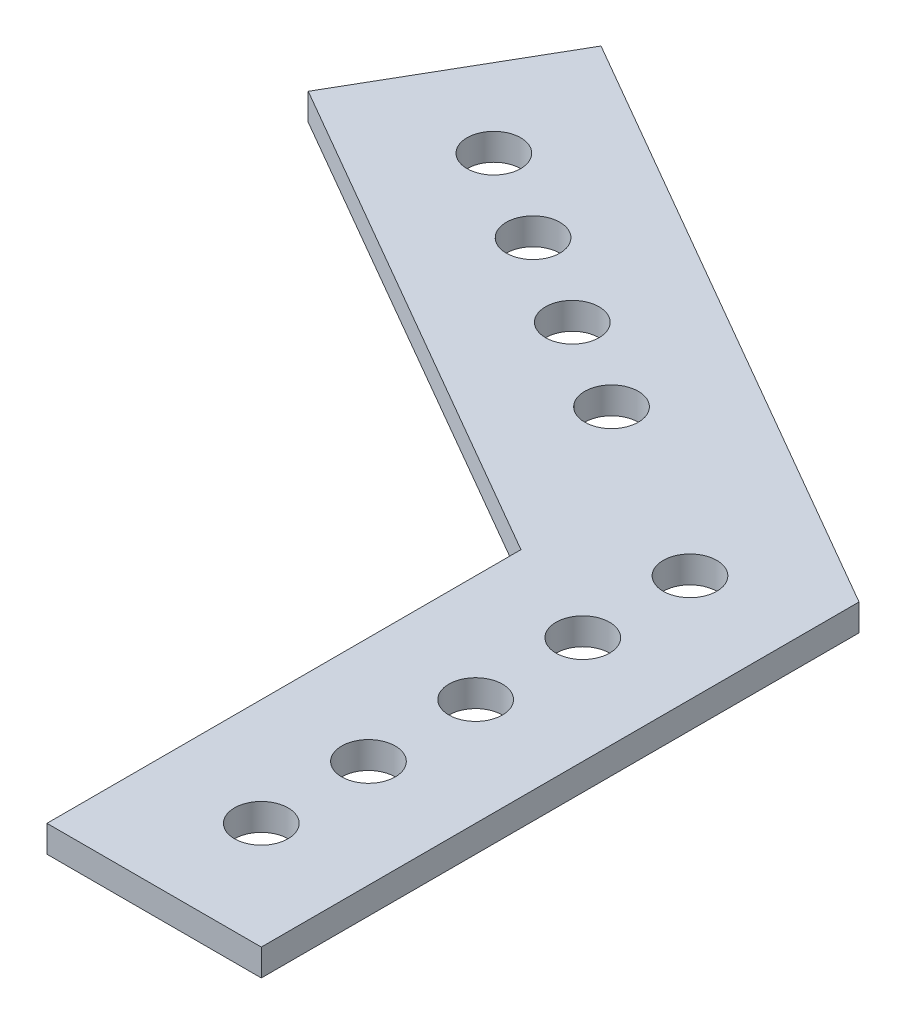
ISO-10303-21;
HEADER;
FILE_DESCRIPTION(('STEP AP214'),'2;1');
FILE_NAME('part.step','',(''),(''),'','','');
FILE_SCHEMA(('AUTOMOTIVE_DESIGN { 1 0 10303 214 1 1 1 1 }'));
ENDSEC;
DATA;
#1=APPLICATION_CONTEXT('core data for automotive mechanical design processes');
#2=APPLICATION_PROTOCOL_DEFINITION('international standard','automotive_design',2000,#1);
#3=PRODUCT_CONTEXT('',#1,'mechanical');
#4=PRODUCT('Part','Part','',(#3));
#5=PRODUCT_RELATED_PRODUCT_CATEGORY('part','',(#4));
#6=PRODUCT_DEFINITION_FORMATION('','',#4);
#7=PRODUCT_DEFINITION_CONTEXT('part definition',#1,'design');
#8=PRODUCT_DEFINITION('design','',#6,#7);
#9=PRODUCT_DEFINITION_SHAPE('','',#8);
#10=(LENGTH_UNIT() NAMED_UNIT(*) SI_UNIT(.MILLI.,.METRE.));
#11=(NAMED_UNIT(*) PLANE_ANGLE_UNIT() SI_UNIT($,.RADIAN.));
#12=(NAMED_UNIT(*) SI_UNIT($,.STERADIAN.) SOLID_ANGLE_UNIT());
#13=UNCERTAINTY_MEASURE_WITH_UNIT(LENGTH_MEASURE(1.E-05),#10,'distance_accuracy_value','');
#14=(GEOMETRIC_REPRESENTATION_CONTEXT(3) GLOBAL_UNCERTAINTY_ASSIGNED_CONTEXT((#13)) GLOBAL_UNIT_ASSIGNED_CONTEXT((#10,
#11,#12)) REPRESENTATION_CONTEXT('',''));
#15=CARTESIAN_POINT('',(0.,0.,0.));
#16=DIRECTION('',(0.,0.,1.));
#17=DIRECTION('',(1.,0.,0.));
#18=AXIS2_PLACEMENT_3D('',#15,#16,#17);
#19=CARTESIAN_POINT('',(12.7,3.175,-7.33234841870821));
#20=DIRECTION('',(-0.500000000000004,0.,0.866025403784436));
#21=DIRECTION('',(0.866025403784436,0.,0.500000000000004));
#22=AXIS2_PLACEMENT_3D('',#19,#20,#21);
#23=PLANE('',#22);
#24=DIRECTION('',(-0.866025403784436,0.,-0.500000000000004));
#25=VECTOR('',#24,1.);
#26=CARTESIAN_POINT('',(12.7,0.,-7.33234841870821));
#27=LINE('',#26,#25);
#28=CARTESIAN_POINT('',(12.7,0.,-7.33234841870821));
#29=VERTEX_POINT('',#28);
#30=CARTESIAN_POINT('',(-59.641135768374,0.,-49.0985226280626));
#31=VERTEX_POINT('',#30);
#32=EDGE_CURVE('E119',#29,#31,#27,.T.);
#33=ORIENTED_EDGE('',*,*,#32,.T.);
#34=DIRECTION('',(0.,-1.,0.));
#35=VECTOR('',#34,1.);
#36=CARTESIAN_POINT('',(-59.641135768374,3.175,-49.0985226280626));
#37=LINE('',#36,#35);
#38=CARTESIAN_POINT('',(-59.641135768374,3.175,-49.0985226280626));
#39=VERTEX_POINT('',#38);
#40=EDGE_CURVE('E11',#39,#31,#37,.T.);
#41=ORIENTED_EDGE('',*,*,#40,.F.);
#42=DIRECTION('',(-0.866025403784436,0.,-0.500000000000004));
#43=VECTOR('',#42,1.);
#44=CARTESIAN_POINT('',(12.7,3.175,-7.33234841870821));
#45=LINE('',#44,#43);
#46=CARTESIAN_POINT('',(12.7,3.175,-7.33234841870821));
#47=VERTEX_POINT('',#46);
#48=EDGE_CURVE('E130',#47,#39,#45,.T.);
#49=ORIENTED_EDGE('',*,*,#48,.F.);
#50=DIRECTION('',(0.,-1.,0.));
#51=VECTOR('',#50,1.);
#52=CARTESIAN_POINT('',(12.7,3.175,-7.33234841870821));
#53=LINE('',#52,#51);
#54=EDGE_CURVE('E115',#47,#29,#53,.T.);
#55=ORIENTED_EDGE('',*,*,#54,.T.);
#56=EDGE_LOOP('',(#33,#41,#49,#55));
#57=FACE_BOUND('',#56,.T.);
#58=ADVANCED_FACE('F35',(#57),#23,.F.);
#59=CARTESIAN_POINT('',(-72.3411357683741,3.175,-27.101477371938));
#60=DIRECTION('',(0.866025403784436,0.,0.500000000000004));
#61=DIRECTION('',(0.500000000000004,0.,-0.866025403784436));
#62=AXIS2_PLACEMENT_3D('',#59,#60,#61);
#63=PLANE('',#62);
#64=DIRECTION('',(-0.500000000000004,0.,0.866025403784436));
#65=VECTOR('',#64,1.);
#66=CARTESIAN_POINT('',(-72.3411357683741,0.,-27.101477371938));
#67=LINE('',#66,#65);
#68=CARTESIAN_POINT('',(-72.3411357683741,0.,-27.101477371938));
#69=VERTEX_POINT('',#68);
#70=EDGE_CURVE('E122',#31,#69,#67,.T.);
#71=ORIENTED_EDGE('',*,*,#70,.T.);
#72=DIRECTION('',(0.,-1.,0.));
#73=VECTOR('',#72,1.);
#74=CARTESIAN_POINT('',(-72.3411357683741,3.175,-27.101477371938));
#75=LINE('',#74,#73);
#76=CARTESIAN_POINT('',(-72.3411357683741,3.175,-27.101477371938));
#77=VERTEX_POINT('',#76);
#78=EDGE_CURVE('E43',#77,#69,#75,.T.);
#79=ORIENTED_EDGE('',*,*,#78,.F.);
#80=DIRECTION('',(-0.500000000000004,0.,0.866025403784436));
#81=VECTOR('',#80,1.);
#82=CARTESIAN_POINT('',(-72.3411357683741,3.175,-27.101477371938));
#83=LINE('',#82,#81);
#84=EDGE_CURVE('E88',#39,#77,#83,.T.);
#85=ORIENTED_EDGE('',*,*,#84,.F.);
#86=ORIENTED_EDGE('',*,*,#40,.T.);
#87=EDGE_LOOP('',(#71,#79,#85,#86));
#88=FACE_BOUND('',#87,.T.);
#89=ADVANCED_FACE('F155',(#88),#63,.F.);
#90=CARTESIAN_POINT('',(-12.7,3.175,7.33234841870821));
#91=DIRECTION('',(0.500000000000004,0.,-0.866025403784436));
#92=DIRECTION('',(-0.866025403784436,0.,-0.500000000000004));
#93=AXIS2_PLACEMENT_3D('',#90,#91,#92);
#94=PLANE('',#93);
#95=DIRECTION('',(0.866025403784436,0.,0.500000000000004));
#96=VECTOR('',#95,1.);
#97=CARTESIAN_POINT('',(-12.7,0.,7.33234841870821));
#98=LINE('',#97,#96);
#99=CARTESIAN_POINT('',(-12.7,0.,7.33234841870821));
#100=VERTEX_POINT('',#99);
#101=EDGE_CURVE('E125',#69,#100,#98,.T.);
#102=ORIENTED_EDGE('',*,*,#101,.T.);
#103=DIRECTION('',(0.,-1.,0.));
#104=VECTOR('',#103,1.);
#105=CARTESIAN_POINT('',(-12.7,3.175,7.33234841870821));
#106=LINE('',#105,#104);
#107=CARTESIAN_POINT('',(-12.7,3.175,7.33234841870821));
#108=VERTEX_POINT('',#107);
#109=EDGE_CURVE('E110',#108,#100,#106,.T.);
#110=ORIENTED_EDGE('',*,*,#109,.F.);
#111=DIRECTION('',(0.866025403784436,0.,0.500000000000004));
#112=VECTOR('',#111,1.);
#113=CARTESIAN_POINT('',(-12.7,3.175,7.33234841870821));
#114=LINE('',#113,#112);
#115=EDGE_CURVE('E101',#77,#108,#114,.T.);
#116=ORIENTED_EDGE('',*,*,#115,.F.);
#117=ORIENTED_EDGE('',*,*,#78,.T.);
#118=EDGE_LOOP('',(#102,#110,#116,#117));
#119=FACE_BOUND('',#118,.T.);
#120=ADVANCED_FACE('F136',(#119),#94,.F.);
#121=CARTESIAN_POINT('',(-12.7,3.175,7.33234841870821));
#122=DIRECTION('',(1.,0.,0.));
#123=DIRECTION('',(0.,0.,-1.));
#124=AXIS2_PLACEMENT_3D('',#121,#122,#123);
#125=PLANE('',#124);
#126=DIRECTION('',(0.,0.,1.));
#127=VECTOR('',#126,1.);
#128=CARTESIAN_POINT('',(-12.7,0.,7.33234841870821));
#129=LINE('',#128,#127);
#130=CARTESIAN_POINT('',(-12.7,0.,63.5));
#131=VERTEX_POINT('',#130);
#132=EDGE_CURVE('E109',#100,#131,#129,.T.);
#133=ORIENTED_EDGE('',*,*,#132,.T.);
#134=DIRECTION('',(0.,-1.,0.));
#135=VECTOR('',#134,1.);
#136=CARTESIAN_POINT('',(-12.7,3.175,63.5));
#137=LINE('',#136,#135);
#138=CARTESIAN_POINT('',(-12.7,3.175,63.5));
#139=VERTEX_POINT('',#138);
#140=EDGE_CURVE('E106',#139,#131,#137,.T.);
#141=ORIENTED_EDGE('',*,*,#140,.F.);
#142=DIRECTION('',(0.,0.,1.));
#143=VECTOR('',#142,1.);
#144=CARTESIAN_POINT('',(-12.7,3.175,7.33234841870821));
#145=LINE('',#144,#143);
#146=EDGE_CURVE('E95',#108,#139,#145,.T.);
#147=ORIENTED_EDGE('',*,*,#146,.F.);
#148=ORIENTED_EDGE('',*,*,#109,.T.);
#149=EDGE_LOOP('',(#133,#141,#147,#148));
#150=FACE_BOUND('',#149,.T.);
#151=ADVANCED_FACE('F107',(#150),#125,.F.);
#152=CARTESIAN_POINT('',(-12.7,3.175,63.5));
#153=DIRECTION('',(0.,0.,-1.));
#154=DIRECTION('',(-1.,0.,0.));
#155=AXIS2_PLACEMENT_3D('',#152,#153,#154);
#156=PLANE('',#155);
#157=DIRECTION('',(1.,0.,0.));
#158=VECTOR('',#157,1.);
#159=CARTESIAN_POINT('',(-12.7,0.,63.5));
#160=LINE('',#159,#158);
#161=CARTESIAN_POINT('',(12.7,0.,63.5));
#162=VERTEX_POINT('',#161);
#163=EDGE_CURVE('E74',#131,#162,#160,.T.);
#164=ORIENTED_EDGE('',*,*,#163,.T.);
#165=DIRECTION('',(0.,-1.,0.));
#166=VECTOR('',#165,1.);
#167=CARTESIAN_POINT('',(12.7,3.175,63.5));
#168=LINE('',#167,#166);
#169=CARTESIAN_POINT('',(12.7,3.175,63.5));
#170=VERTEX_POINT('',#169);
#171=EDGE_CURVE('E111',#170,#162,#168,.T.);
#172=ORIENTED_EDGE('',*,*,#171,.F.);
#173=DIRECTION('',(1.,0.,0.));
#174=VECTOR('',#173,1.);
#175=CARTESIAN_POINT('',(-12.7,3.175,63.5));
#176=LINE('',#175,#174);
#177=EDGE_CURVE('E99',#139,#170,#176,.T.);
#178=ORIENTED_EDGE('',*,*,#177,.F.);
#179=ORIENTED_EDGE('',*,*,#140,.T.);
#180=EDGE_LOOP('',(#164,#172,#178,#179));
#181=FACE_BOUND('',#180,.T.);
#182=ADVANCED_FACE('F113',(#181),#156,.F.);
#183=CARTESIAN_POINT('',(12.7,3.175,-7.33234841870821));
#184=DIRECTION('',(-1.,0.,0.));
#185=DIRECTION('',(0.,0.,1.));
#186=AXIS2_PLACEMENT_3D('',#183,#184,#185);
#187=PLANE('',#186);
#188=DIRECTION('',(0.,0.,-1.));
#189=VECTOR('',#188,1.);
#190=CARTESIAN_POINT('',(12.7,0.,-7.33234841870821));
#191=LINE('',#190,#189);
#192=EDGE_CURVE('E80',#162,#29,#191,.T.);
#193=ORIENTED_EDGE('',*,*,#192,.T.);
#194=ORIENTED_EDGE('',*,*,#54,.F.);
#195=DIRECTION('',(0.,0.,-1.));
#196=VECTOR('',#195,1.);
#197=CARTESIAN_POINT('',(12.7,3.175,-7.33234841870821));
#198=LINE('',#197,#196);
#199=EDGE_CURVE('E51',#170,#47,#198,.T.);
#200=ORIENTED_EDGE('',*,*,#199,.F.);
#201=ORIENTED_EDGE('',*,*,#171,.T.);
#202=EDGE_LOOP('',(#193,#194,#200,#201));
#203=FACE_BOUND('',#202,.T.);
#204=ADVANCED_FACE('F143',(#203),#187,.F.);
#205=CARTESIAN_POINT('',(0.,3.175,0.));
#206=DIRECTION('',(0.,-1.,0.));
#207=DIRECTION('',(0.,0.,-1.));
#208=AXIS2_PLACEMENT_3D('',#205,#206,#207);
#209=PLANE('',#208);
#210=CARTESIAN_POINT('',(0.,3.175,12.7));
#211=DIRECTION('',(0.,1.,0.));
#212=DIRECTION('',(0.,0.,1.));
#213=AXIS2_PLACEMENT_3D('',#210,#211,#212);
#214=CIRCLE('',#213,3.175);
#215=CARTESIAN_POINT('',(0.,3.175,15.875));
#216=VERTEX_POINT('',#215);
#217=EDGE_CURVE('E293',#216,#216,#214,.T.);
#218=ORIENTED_EDGE('',*,*,#217,.F.);
#219=EDGE_LOOP('',(#218));
#220=FACE_BOUND('',#219,.T.);
#221=CARTESIAN_POINT('',(0.,3.175,25.4));
#222=DIRECTION('',(0.,1.,0.));
#223=DIRECTION('',(0.,0.,1.));
#224=AXIS2_PLACEMENT_3D('',#221,#222,#223);
#225=CIRCLE('',#224,3.175);
#226=CARTESIAN_POINT('',(0.,3.175,28.575));
#227=VERTEX_POINT('',#226);
#228=EDGE_CURVE('E295',#227,#227,#225,.T.);
#229=ORIENTED_EDGE('',*,*,#228,.F.);
#230=EDGE_LOOP('',(#229));
#231=FACE_BOUND('',#230,.T.);
#232=CARTESIAN_POINT('',(0.,3.175,38.1));
#233=DIRECTION('',(0.,1.,0.));
#234=DIRECTION('',(0.,0.,1.));
#235=AXIS2_PLACEMENT_3D('',#232,#233,#234);
#236=CIRCLE('',#235,3.175);
#237=CARTESIAN_POINT('',(0.,3.175,41.275));
#238=VERTEX_POINT('',#237);
#239=EDGE_CURVE('E301',#238,#238,#236,.T.);
#240=ORIENTED_EDGE('',*,*,#239,.F.);
#241=EDGE_LOOP('',(#240));
#242=FACE_BOUND('',#241,.T.);
#243=CARTESIAN_POINT('',(0.,3.175,50.8));
#244=DIRECTION('',(0.,1.,0.));
#245=DIRECTION('',(0.,0.,1.));
#246=AXIS2_PLACEMENT_3D('',#243,#244,#245);
#247=CIRCLE('',#246,3.175);
#248=CARTESIAN_POINT('',(0.,3.175,53.975));
#249=VERTEX_POINT('',#248);
#250=EDGE_CURVE('E307',#249,#249,#247,.T.);
#251=ORIENTED_EDGE('',*,*,#250,.F.);
#252=EDGE_LOOP('',(#251));
#253=FACE_BOUND('',#252,.T.);
#254=CARTESIAN_POINT('',(0.,3.175,0.));
#255=DIRECTION('',(0.,1.,0.));
#256=DIRECTION('',(0.,0.,1.));
#257=AXIS2_PLACEMENT_3D('',#254,#255,#256);
#258=CIRCLE('',#257,3.175);
#259=CARTESIAN_POINT('',(0.,3.175,3.175));
#260=VERTEX_POINT('',#259);
#261=EDGE_CURVE('E313',#260,#260,#258,.T.);
#262=ORIENTED_EDGE('',*,*,#261,.F.);
#263=EDGE_LOOP('',(#262));
#264=FACE_BOUND('',#263,.T.);
#265=CARTESIAN_POINT('',(-21.9970452561244,3.175,-12.7000000000005));
#266=DIRECTION('',(0.,1.,0.));
#267=DIRECTION('',(0.,0.,1.));
#268=AXIS2_PLACEMENT_3D('',#265,#266,#267);
#269=CIRCLE('',#268,3.175);
#270=CARTESIAN_POINT('',(-21.9970452561244,3.175,-9.52500000000052));
#271=VERTEX_POINT('',#270);
#272=EDGE_CURVE('E319',#271,#271,#269,.T.);
#273=ORIENTED_EDGE('',*,*,#272,.F.);
#274=EDGE_LOOP('',(#273));
#275=FACE_BOUND('',#274,.T.);
#276=CARTESIAN_POINT('',(-32.9955678841869,3.175,-19.0500000000004));
#277=DIRECTION('',(0.,1.,0.));
#278=DIRECTION('',(0.,0.,1.));
#279=AXIS2_PLACEMENT_3D('',#276,#277,#278);
#280=CIRCLE('',#279,3.175);
#281=CARTESIAN_POINT('',(-32.9955678841869,3.175,-15.8750000000004));
#282=VERTEX_POINT('',#281);
#283=EDGE_CURVE('E325',#282,#282,#280,.T.);
#284=ORIENTED_EDGE('',*,*,#283,.F.);
#285=EDGE_LOOP('',(#284));
#286=FACE_BOUND('',#285,.T.);
#287=CARTESIAN_POINT('',(-43.9940905122493,3.175,-25.4000000000003));
#288=DIRECTION('',(0.,1.,0.));
#289=DIRECTION('',(0.,0.,1.));
#290=AXIS2_PLACEMENT_3D('',#287,#288,#289);
#291=CIRCLE('',#290,3.175);
#292=CARTESIAN_POINT('',(-43.9940905122493,3.175,-22.2250000000003));
#293=VERTEX_POINT('',#292);
#294=EDGE_CURVE('E331',#293,#293,#291,.T.);
#295=ORIENTED_EDGE('',*,*,#294,.F.);
#296=EDGE_LOOP('',(#295));
#297=FACE_BOUND('',#296,.T.);
#298=CARTESIAN_POINT('',(-54.9926131403117,3.175,-31.7500000000003));
#299=DIRECTION('',(0.,1.,0.));
#300=DIRECTION('',(0.,0.,1.));
#301=AXIS2_PLACEMENT_3D('',#298,#299,#300);
#302=CIRCLE('',#301,3.17500000000001);
#303=CARTESIAN_POINT('',(-54.9926131403117,3.175,-28.5750000000003));
#304=VERTEX_POINT('',#303);
#305=EDGE_CURVE('E337',#304,#304,#302,.T.);
#306=ORIENTED_EDGE('',*,*,#305,.F.);
#307=EDGE_LOOP('',(#306));
#308=FACE_BOUND('',#307,.T.);
#309=ORIENTED_EDGE('',*,*,#48,.T.);
#310=ORIENTED_EDGE('',*,*,#84,.T.);
#311=ORIENTED_EDGE('',*,*,#115,.T.);
#312=ORIENTED_EDGE('',*,*,#146,.T.);
#313=ORIENTED_EDGE('',*,*,#177,.T.);
#314=ORIENTED_EDGE('',*,*,#199,.T.);
#315=EDGE_LOOP('',(#309,#310,#311,#312,#313,#314));
#316=FACE_BOUND('',#315,.T.);
#317=ADVANCED_FACE('F97',(#220,#231,#242,#253,#264,#275,#286,#297,#308,#316),#209,.F.);
#318=CARTESIAN_POINT('',(0.,0.,0.));
#319=DIRECTION('',(0.,-1.,0.));
#320=DIRECTION('',(0.,0.,-1.));
#321=AXIS2_PLACEMENT_3D('',#318,#319,#320);
#322=PLANE('',#321);
#323=CARTESIAN_POINT('',(0.,0.,12.7));
#324=DIRECTION('',(0.,1.,0.));
#325=DIRECTION('',(0.,0.,1.));
#326=AXIS2_PLACEMENT_3D('',#323,#324,#325);
#327=CIRCLE('',#326,3.175);
#328=CARTESIAN_POINT('',(0.,0.,15.875));
#329=VERTEX_POINT('',#328);
#330=EDGE_CURVE('E290',#329,#329,#327,.T.);
#331=ORIENTED_EDGE('',*,*,#330,.T.);
#332=EDGE_LOOP('',(#331));
#333=FACE_BOUND('',#332,.T.);
#334=CARTESIAN_POINT('',(0.,0.,25.4));
#335=DIRECTION('',(0.,1.,0.));
#336=DIRECTION('',(0.,0.,1.));
#337=AXIS2_PLACEMENT_3D('',#334,#335,#336);
#338=CIRCLE('',#337,3.175);
#339=CARTESIAN_POINT('',(0.,0.,28.575));
#340=VERTEX_POINT('',#339);
#341=EDGE_CURVE('E298',#340,#340,#338,.T.);
#342=ORIENTED_EDGE('',*,*,#341,.T.);
#343=EDGE_LOOP('',(#342));
#344=FACE_BOUND('',#343,.T.);
#345=CARTESIAN_POINT('',(0.,0.,38.1));
#346=DIRECTION('',(0.,1.,0.));
#347=DIRECTION('',(0.,0.,1.));
#348=AXIS2_PLACEMENT_3D('',#345,#346,#347);
#349=CIRCLE('',#348,3.175);
#350=CARTESIAN_POINT('',(0.,0.,41.275));
#351=VERTEX_POINT('',#350);
#352=EDGE_CURVE('E304',#351,#351,#349,.T.);
#353=ORIENTED_EDGE('',*,*,#352,.T.);
#354=EDGE_LOOP('',(#353));
#355=FACE_BOUND('',#354,.T.);
#356=CARTESIAN_POINT('',(0.,0.,50.8));
#357=DIRECTION('',(0.,1.,0.));
#358=DIRECTION('',(0.,0.,1.));
#359=AXIS2_PLACEMENT_3D('',#356,#357,#358);
#360=CIRCLE('',#359,3.175);
#361=CARTESIAN_POINT('',(0.,0.,53.975));
#362=VERTEX_POINT('',#361);
#363=EDGE_CURVE('E310',#362,#362,#360,.T.);
#364=ORIENTED_EDGE('',*,*,#363,.T.);
#365=EDGE_LOOP('',(#364));
#366=FACE_BOUND('',#365,.T.);
#367=CARTESIAN_POINT('',(0.,0.,0.));
#368=DIRECTION('',(0.,1.,0.));
#369=DIRECTION('',(0.,0.,1.));
#370=AXIS2_PLACEMENT_3D('',#367,#368,#369);
#371=CIRCLE('',#370,3.175);
#372=CARTESIAN_POINT('',(0.,0.,3.175));
#373=VERTEX_POINT('',#372);
#374=EDGE_CURVE('E316',#373,#373,#371,.T.);
#375=ORIENTED_EDGE('',*,*,#374,.T.);
#376=EDGE_LOOP('',(#375));
#377=FACE_BOUND('',#376,.T.);
#378=CARTESIAN_POINT('',(-21.9970452561244,0.,-12.7000000000005));
#379=DIRECTION('',(0.,1.,0.));
#380=DIRECTION('',(0.,0.,1.));
#381=AXIS2_PLACEMENT_3D('',#378,#379,#380);
#382=CIRCLE('',#381,3.175);
#383=CARTESIAN_POINT('',(-21.9970452561244,0.,-9.52500000000052));
#384=VERTEX_POINT('',#383);
#385=EDGE_CURVE('E322',#384,#384,#382,.T.);
#386=ORIENTED_EDGE('',*,*,#385,.T.);
#387=EDGE_LOOP('',(#386));
#388=FACE_BOUND('',#387,.T.);
#389=CARTESIAN_POINT('',(-32.9955678841869,0.,-19.0500000000004));
#390=DIRECTION('',(0.,1.,0.));
#391=DIRECTION('',(0.,0.,1.));
#392=AXIS2_PLACEMENT_3D('',#389,#390,#391);
#393=CIRCLE('',#392,3.175);
#394=CARTESIAN_POINT('',(-32.9955678841869,0.,-15.8750000000004));
#395=VERTEX_POINT('',#394);
#396=EDGE_CURVE('E328',#395,#395,#393,.T.);
#397=ORIENTED_EDGE('',*,*,#396,.T.);
#398=EDGE_LOOP('',(#397));
#399=FACE_BOUND('',#398,.T.);
#400=CARTESIAN_POINT('',(-43.9940905122493,0.,-25.4000000000003));
#401=DIRECTION('',(0.,1.,0.));
#402=DIRECTION('',(0.,0.,1.));
#403=AXIS2_PLACEMENT_3D('',#400,#401,#402);
#404=CIRCLE('',#403,3.175);
#405=CARTESIAN_POINT('',(-43.9940905122493,0.,-22.2250000000003));
#406=VERTEX_POINT('',#405);
#407=EDGE_CURVE('E334',#406,#406,#404,.T.);
#408=ORIENTED_EDGE('',*,*,#407,.T.);
#409=EDGE_LOOP('',(#408));
#410=FACE_BOUND('',#409,.T.);
#411=CARTESIAN_POINT('',(-54.9926131403117,0.,-31.7500000000003));
#412=DIRECTION('',(0.,1.,0.));
#413=DIRECTION('',(0.,0.,1.));
#414=AXIS2_PLACEMENT_3D('',#411,#412,#413);
#415=CIRCLE('',#414,3.17500000000001);
#416=CARTESIAN_POINT('',(-54.9926131403117,0.,-28.5750000000003));
#417=VERTEX_POINT('',#416);
#418=EDGE_CURVE('E123',#417,#417,#415,.T.);
#419=ORIENTED_EDGE('',*,*,#418,.T.);
#420=EDGE_LOOP('',(#419));
#421=FACE_BOUND('',#420,.T.);
#422=ORIENTED_EDGE('',*,*,#32,.F.);
#423=ORIENTED_EDGE('',*,*,#192,.F.);
#424=ORIENTED_EDGE('',*,*,#163,.F.);
#425=ORIENTED_EDGE('',*,*,#132,.F.);
#426=ORIENTED_EDGE('',*,*,#101,.F.);
#427=ORIENTED_EDGE('',*,*,#70,.F.);
#428=EDGE_LOOP('',(#422,#423,#424,#425,#426,#427));
#429=FACE_BOUND('',#428,.T.);
#430=ADVANCED_FACE('F139',(#333,#344,#355,#366,#377,#388,#399,#410,#421,#429),#322,.T.);
#431=CARTESIAN_POINT('',(-54.9926131403117,0.,-31.7500000000003));
#432=DIRECTION('',(0.,1.,0.));
#433=DIRECTION('',(0.,0.,1.));
#434=AXIS2_PLACEMENT_3D('',#431,#432,#433);
#435=CYLINDRICAL_SURFACE('',#434,3.17500000000001);
#436=ORIENTED_EDGE('',*,*,#418,.F.);
#437=EDGE_LOOP('',(#436));
#438=FACE_BOUND('',#437,.T.);
#439=ORIENTED_EDGE('',*,*,#305,.T.);
#440=EDGE_LOOP('',(#439));
#441=FACE_BOUND('',#440,.T.);
#442=ADVANCED_FACE('F194',(#438,#441),#435,.F.);
#443=CARTESIAN_POINT('',(-43.9940905122493,0.,-25.4000000000003));
#444=DIRECTION('',(0.,1.,0.));
#445=DIRECTION('',(0.,0.,1.));
#446=AXIS2_PLACEMENT_3D('',#443,#444,#445);
#447=CYLINDRICAL_SURFACE('',#446,3.175);
#448=ORIENTED_EDGE('',*,*,#407,.F.);
#449=EDGE_LOOP('',(#448));
#450=FACE_BOUND('',#449,.T.);
#451=ORIENTED_EDGE('',*,*,#294,.T.);
#452=EDGE_LOOP('',(#451));
#453=FACE_BOUND('',#452,.T.);
#454=ADVANCED_FACE('F203',(#450,#453),#447,.F.);
#455=CARTESIAN_POINT('',(-32.9955678841869,0.,-19.0500000000004));
#456=DIRECTION('',(0.,1.,0.));
#457=DIRECTION('',(0.,0.,1.));
#458=AXIS2_PLACEMENT_3D('',#455,#456,#457);
#459=CYLINDRICAL_SURFACE('',#458,3.175);
#460=ORIENTED_EDGE('',*,*,#396,.F.);
#461=EDGE_LOOP('',(#460));
#462=FACE_BOUND('',#461,.T.);
#463=ORIENTED_EDGE('',*,*,#283,.T.);
#464=EDGE_LOOP('',(#463));
#465=FACE_BOUND('',#464,.T.);
#466=ADVANCED_FACE('F213',(#462,#465),#459,.F.);
#467=CARTESIAN_POINT('',(-21.9970452561244,0.,-12.7000000000005));
#468=DIRECTION('',(0.,1.,0.));
#469=DIRECTION('',(0.,0.,1.));
#470=AXIS2_PLACEMENT_3D('',#467,#468,#469);
#471=CYLINDRICAL_SURFACE('',#470,3.175);
#472=ORIENTED_EDGE('',*,*,#385,.F.);
#473=EDGE_LOOP('',(#472));
#474=FACE_BOUND('',#473,.T.);
#475=ORIENTED_EDGE('',*,*,#272,.T.);
#476=EDGE_LOOP('',(#475));
#477=FACE_BOUND('',#476,.T.);
#478=ADVANCED_FACE('F223',(#474,#477),#471,.F.);
#479=CARTESIAN_POINT('',(0.,0.,0.));
#480=DIRECTION('',(0.,1.,0.));
#481=DIRECTION('',(0.,0.,1.));
#482=AXIS2_PLACEMENT_3D('',#479,#480,#481);
#483=CYLINDRICAL_SURFACE('',#482,3.175);
#484=ORIENTED_EDGE('',*,*,#374,.F.);
#485=EDGE_LOOP('',(#484));
#486=FACE_BOUND('',#485,.T.);
#487=ORIENTED_EDGE('',*,*,#261,.T.);
#488=EDGE_LOOP('',(#487));
#489=FACE_BOUND('',#488,.T.);
#490=ADVANCED_FACE('F233',(#486,#489),#483,.F.);
#491=CARTESIAN_POINT('',(0.,0.,50.8));
#492=DIRECTION('',(0.,1.,0.));
#493=DIRECTION('',(0.,0.,1.));
#494=AXIS2_PLACEMENT_3D('',#491,#492,#493);
#495=CYLINDRICAL_SURFACE('',#494,3.175);
#496=ORIENTED_EDGE('',*,*,#363,.F.);
#497=EDGE_LOOP('',(#496));
#498=FACE_BOUND('',#497,.T.);
#499=ORIENTED_EDGE('',*,*,#250,.T.);
#500=EDGE_LOOP('',(#499));
#501=FACE_BOUND('',#500,.T.);
#502=ADVANCED_FACE('F243',(#498,#501),#495,.F.);
#503=CARTESIAN_POINT('',(0.,0.,38.1));
#504=DIRECTION('',(0.,1.,0.));
#505=DIRECTION('',(0.,0.,1.));
#506=AXIS2_PLACEMENT_3D('',#503,#504,#505);
#507=CYLINDRICAL_SURFACE('',#506,3.175);
#508=ORIENTED_EDGE('',*,*,#352,.F.);
#509=EDGE_LOOP('',(#508));
#510=FACE_BOUND('',#509,.T.);
#511=ORIENTED_EDGE('',*,*,#239,.T.);
#512=EDGE_LOOP('',(#511));
#513=FACE_BOUND('',#512,.T.);
#514=ADVANCED_FACE('F253',(#510,#513),#507,.F.);
#515=CARTESIAN_POINT('',(0.,0.,25.4));
#516=DIRECTION('',(0.,1.,0.));
#517=DIRECTION('',(0.,0.,1.));
#518=AXIS2_PLACEMENT_3D('',#515,#516,#517);
#519=CYLINDRICAL_SURFACE('',#518,3.175);
#520=ORIENTED_EDGE('',*,*,#341,.F.);
#521=EDGE_LOOP('',(#520));
#522=FACE_BOUND('',#521,.T.);
#523=ORIENTED_EDGE('',*,*,#228,.T.);
#524=EDGE_LOOP('',(#523));
#525=FACE_BOUND('',#524,.T.);
#526=ADVANCED_FACE('F263',(#522,#525),#519,.F.);
#527=CARTESIAN_POINT('',(0.,0.,12.7));
#528=DIRECTION('',(0.,1.,0.));
#529=DIRECTION('',(0.,0.,1.));
#530=AXIS2_PLACEMENT_3D('',#527,#528,#529);
#531=CYLINDRICAL_SURFACE('',#530,3.175);
#532=ORIENTED_EDGE('',*,*,#330,.F.);
#533=EDGE_LOOP('',(#532));
#534=FACE_BOUND('',#533,.T.);
#535=ORIENTED_EDGE('',*,*,#217,.T.);
#536=EDGE_LOOP('',(#535));
#537=FACE_BOUND('',#536,.T.);
#538=ADVANCED_FACE('F273',(#534,#537),#531,.F.);
#539=CLOSED_SHELL('',(#58,#89,#120,#151,#182,#204,#317,#430,#442,#454,#466,#478,#490,#502,#514,
#526,#538));
#540=MANIFOLD_SOLID_BREP('B2',#539);
#541=ADVANCED_BREP_SHAPE_REPRESENTATION('',(#18,#540),#14);
#542=SHAPE_DEFINITION_REPRESENTATION(#9,#541);
ENDSEC;
END-ISO-10303-21;
